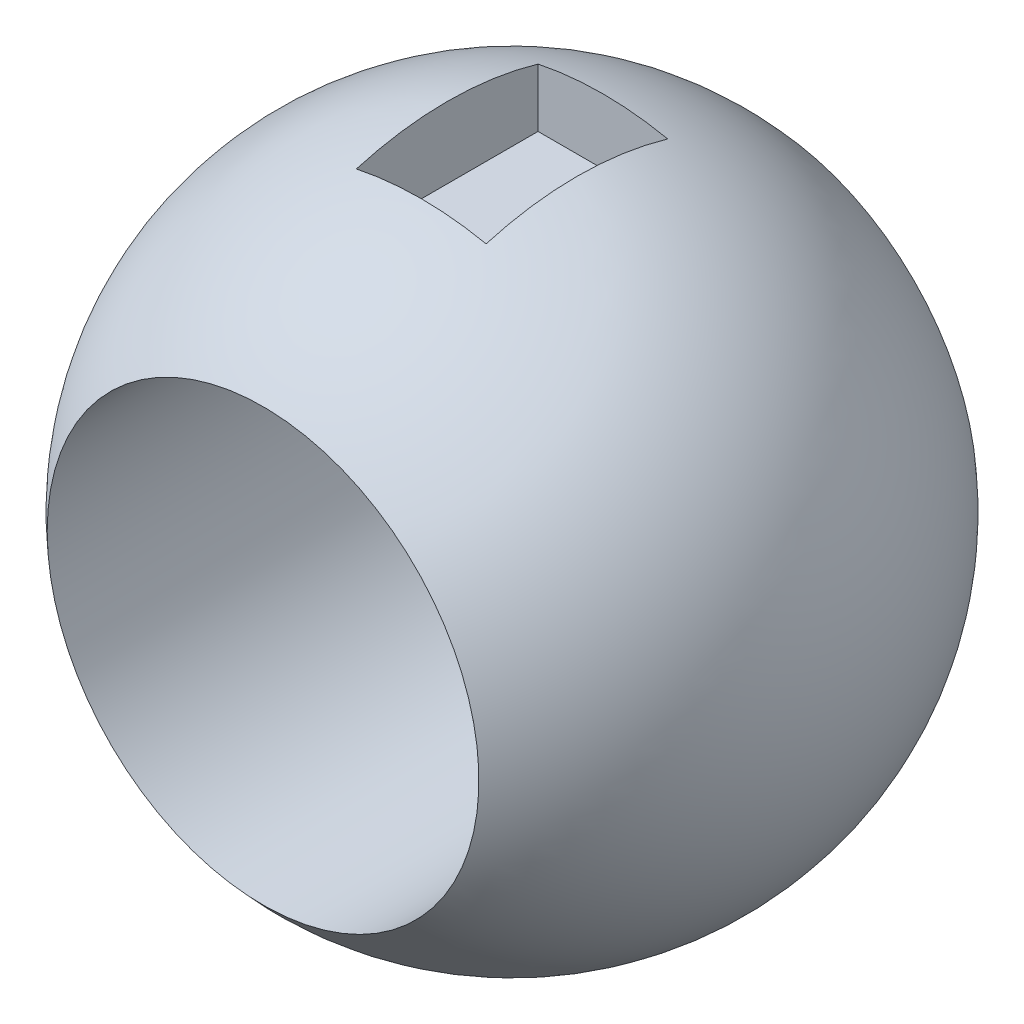
ISO-10303-21;
HEADER;
FILE_DESCRIPTION(('STEP AP214'),'2;1');
FILE_NAME('part.step','',(''),(''),'','','');
FILE_SCHEMA(('AUTOMOTIVE_DESIGN { 1 0 10303 214 1 1 1 1 }'));
ENDSEC;
DATA;
#1=APPLICATION_CONTEXT('core data for automotive mechanical design processes');
#2=APPLICATION_PROTOCOL_DEFINITION('international standard','automotive_design',2000,#1);
#3=PRODUCT_CONTEXT('',#1,'mechanical');
#4=PRODUCT('Part','Part','',(#3));
#5=PRODUCT_RELATED_PRODUCT_CATEGORY('part','',(#4));
#6=PRODUCT_DEFINITION_FORMATION('','',#4);
#7=PRODUCT_DEFINITION_CONTEXT('part definition',#1,'design');
#8=PRODUCT_DEFINITION('design','',#6,#7);
#9=PRODUCT_DEFINITION_SHAPE('','',#8);
#10=(LENGTH_UNIT() NAMED_UNIT(*) SI_UNIT(.MILLI.,.METRE.));
#11=(NAMED_UNIT(*) PLANE_ANGLE_UNIT() SI_UNIT($,.RADIAN.));
#12=(NAMED_UNIT(*) SI_UNIT($,.STERADIAN.) SOLID_ANGLE_UNIT());
#13=UNCERTAINTY_MEASURE_WITH_UNIT(LENGTH_MEASURE(1.E-05),#10,'distance_accuracy_value','');
#14=(GEOMETRIC_REPRESENTATION_CONTEXT(3) GLOBAL_UNCERTAINTY_ASSIGNED_CONTEXT((#13)) GLOBAL_UNIT_ASSIGNED_CONTEXT((#10,
#11,#12)) REPRESENTATION_CONTEXT('',''));
#15=CARTESIAN_POINT('',(0.,0.,0.));
#16=DIRECTION('',(0.,0.,1.));
#17=DIRECTION('',(1.,0.,0.));
#18=AXIS2_PLACEMENT_3D('',#15,#16,#17);
#19=CARTESIAN_POINT('',(0.,0.,0.));
#20=DIRECTION('',(0.,0.,-1.));
#21=DIRECTION('',(-1.,0.,0.));
#22=AXIS2_PLACEMENT_3D('',#19,#20,#21);
#23=SPHERICAL_SURFACE('',#22,25.4);
#24=CARTESIAN_POINT('',(-5.,0.,0.));
#25=DIRECTION('',(-1.,0.,0.));
#26=DIRECTION('',(0.,0.,1.));
#27=AXIS2_PLACEMENT_3D('',#24,#25,#26);
#28=CIRCLE('',#27,24.9030118660374);
#29=CARTESIAN_POINT('',(-5.,23.8989539520038,-7.));
#30=VERTEX_POINT('',#29);
#31=CARTESIAN_POINT('',(-5.,23.8989539520038,7.));
#32=VERTEX_POINT('',#31);
#33=EDGE_CURVE('E11',#30,#32,#28,.F.);
#34=ORIENTED_EDGE('',*,*,#33,.F.);
#35=CARTESIAN_POINT('',(0.,0.,-7.));
#36=DIRECTION('',(0.,0.,-1.));
#37=DIRECTION('',(-1.,0.,0.));
#38=AXIS2_PLACEMENT_3D('',#35,#36,#37);
#39=CIRCLE('',#38,24.416387939251);
#40=CARTESIAN_POINT('',(5.,23.8989539520038,-7.));
#41=VERTEX_POINT('',#40);
#42=EDGE_CURVE('E53',#41,#30,#39,.F.);
#43=ORIENTED_EDGE('',*,*,#42,.F.);
#44=CARTESIAN_POINT('',(5.,0.,0.));
#45=DIRECTION('',(1.,0.,0.));
#46=DIRECTION('',(0.,0.,-1.));
#47=AXIS2_PLACEMENT_3D('',#44,#45,#46);
#48=CIRCLE('',#47,24.9030118660374);
#49=CARTESIAN_POINT('',(5.,23.8989539520038,7.));
#50=VERTEX_POINT('',#49);
#51=EDGE_CURVE('E132',#50,#41,#48,.F.);
#52=ORIENTED_EDGE('',*,*,#51,.F.);
#53=CARTESIAN_POINT('',(0.,0.,7.));
#54=DIRECTION('',(0.,0.,1.));
#55=DIRECTION('',(1.,0.,0.));
#56=AXIS2_PLACEMENT_3D('',#53,#54,#55);
#57=CIRCLE('',#56,24.416387939251);
#58=EDGE_CURVE('E129',#32,#50,#57,.F.);
#59=ORIENTED_EDGE('',*,*,#58,.F.);
#60=EDGE_LOOP('',(#34,#43,#52,#59));
#61=FACE_BOUND('',#60,.T.);
#62=CARTESIAN_POINT('',(0.,0.,19.1929734798962));
#63=DIRECTION('',(0.,0.,-1.));
#64=DIRECTION('',(-1.,0.,0.));
#65=AXIS2_PLACEMENT_3D('',#62,#63,#64);
#66=CIRCLE('',#65,16.637);
#67=CARTESIAN_POINT('',(-16.637,0.,19.1929734798962));
#68=VERTEX_POINT('',#67);
#69=EDGE_CURVE('E125',#68,#68,#66,.F.);
#70=ORIENTED_EDGE('',*,*,#69,.F.);
#71=EDGE_LOOP('',(#70));
#72=FACE_BOUND('',#71,.T.);
#73=CARTESIAN_POINT('',(0.,0.,-19.1929734798962));
#74=DIRECTION('',(0.,0.,1.));
#75=DIRECTION('',(1.,0.,0.));
#76=AXIS2_PLACEMENT_3D('',#73,#74,#75);
#77=CIRCLE('',#76,16.637);
#78=CARTESIAN_POINT('',(16.637,0.,-19.1929734798962));
#79=VERTEX_POINT('',#78);
#80=EDGE_CURVE('E116',#79,#79,#77,.F.);
#81=ORIENTED_EDGE('',*,*,#80,.F.);
#82=EDGE_LOOP('',(#81));
#83=FACE_BOUND('',#82,.T.);
#84=ADVANCED_FACE('F45',(#61,#72,#83),#23,.T.);
#85=CARTESIAN_POINT('',(0.,0.,-22.3866031366976));
#86=DIRECTION('',(0.,0.,1.));
#87=DIRECTION('',(1.,0.,0.));
#88=AXIS2_PLACEMENT_3D('',#85,#86,#87);
#89=CYLINDRICAL_SURFACE('',#88,16.637);
#90=ORIENTED_EDGE('',*,*,#69,.T.);
#91=EDGE_LOOP('',(#90));
#92=FACE_BOUND('',#91,.T.);
#93=ORIENTED_EDGE('',*,*,#80,.T.);
#94=EDGE_LOOP('',(#93));
#95=FACE_BOUND('',#94,.T.);
#96=ADVANCED_FACE('F142',(#92,#95),#89,.F.);
#97=CARTESIAN_POINT('',(-5.,19.4,7.));
#98=DIRECTION('',(-1.,0.,0.));
#99=DIRECTION('',(0.,0.,1.));
#100=AXIS2_PLACEMENT_3D('',#97,#98,#99);
#101=PLANE('',#100);
#102=ORIENTED_EDGE('',*,*,#33,.T.);
#103=DIRECTION('',(0.,1.,0.));
#104=VECTOR('',#103,1.);
#105=CARTESIAN_POINT('',(-5.,19.4,7.));
#106=LINE('',#105,#104);
#107=CARTESIAN_POINT('',(-5.,19.4,7.));
#108=VERTEX_POINT('',#107);
#109=EDGE_CURVE('E60',#108,#32,#106,.T.);
#110=ORIENTED_EDGE('',*,*,#109,.F.);
#111=DIRECTION('',(0.,0.,1.));
#112=VECTOR('',#111,1.);
#113=CARTESIAN_POINT('',(-5.,19.4,7.));
#114=LINE('',#113,#112);
#115=CARTESIAN_POINT('',(-5.,19.4,-7.));
#116=VERTEX_POINT('',#115);
#117=EDGE_CURVE('E86',#116,#108,#114,.T.);
#118=ORIENTED_EDGE('',*,*,#117,.F.);
#119=DIRECTION('',(0.,1.,0.));
#120=VECTOR('',#119,1.);
#121=CARTESIAN_POINT('',(-5.,19.4,-7.));
#122=LINE('',#121,#120);
#123=EDGE_CURVE('E113',#116,#30,#122,.T.);
#124=ORIENTED_EDGE('',*,*,#123,.T.);
#125=EDGE_LOOP('',(#102,#110,#118,#124));
#126=FACE_BOUND('',#125,.T.);
#127=ADVANCED_FACE('F84',(#126),#101,.F.);
#128=CARTESIAN_POINT('',(5.,19.4,-7.));
#129=DIRECTION('',(0.,0.,-1.));
#130=DIRECTION('',(-1.,0.,0.));
#131=AXIS2_PLACEMENT_3D('',#128,#129,#130);
#132=PLANE('',#131);
#133=ORIENTED_EDGE('',*,*,#42,.T.);
#134=ORIENTED_EDGE('',*,*,#123,.F.);
#135=DIRECTION('',(-1.,0.,0.));
#136=VECTOR('',#135,1.);
#137=CARTESIAN_POINT('',(5.,19.4,-7.));
#138=LINE('',#137,#136);
#139=CARTESIAN_POINT('',(5.,19.4,-7.));
#140=VERTEX_POINT('',#139);
#141=EDGE_CURVE('E92',#140,#116,#138,.T.);
#142=ORIENTED_EDGE('',*,*,#141,.F.);
#143=DIRECTION('',(0.,1.,0.));
#144=VECTOR('',#143,1.);
#145=CARTESIAN_POINT('',(5.,19.4,-7.));
#146=LINE('',#145,#144);
#147=EDGE_CURVE('E117',#140,#41,#146,.T.);
#148=ORIENTED_EDGE('',*,*,#147,.T.);
#149=EDGE_LOOP('',(#133,#134,#142,#148));
#150=FACE_BOUND('',#149,.T.);
#151=ADVANCED_FACE('F139',(#150),#132,.F.);
#152=CARTESIAN_POINT('',(5.,19.4,7.));
#153=DIRECTION('',(1.,0.,0.));
#154=DIRECTION('',(0.,0.,-1.));
#155=AXIS2_PLACEMENT_3D('',#152,#153,#154);
#156=PLANE('',#155);
#157=ORIENTED_EDGE('',*,*,#51,.T.);
#158=ORIENTED_EDGE('',*,*,#147,.F.);
#159=DIRECTION('',(0.,0.,-1.));
#160=VECTOR('',#159,1.);
#161=CARTESIAN_POINT('',(5.,19.4,7.));
#162=LINE('',#161,#160);
#163=CARTESIAN_POINT('',(5.,19.4,7.));
#164=VERTEX_POINT('',#163);
#165=EDGE_CURVE('E102',#164,#140,#162,.T.);
#166=ORIENTED_EDGE('',*,*,#165,.F.);
#167=DIRECTION('',(0.,1.,0.));
#168=VECTOR('',#167,1.);
#169=CARTESIAN_POINT('',(5.,19.4,7.));
#170=LINE('',#169,#168);
#171=EDGE_CURVE('E91',#164,#50,#170,.T.);
#172=ORIENTED_EDGE('',*,*,#171,.T.);
#173=EDGE_LOOP('',(#157,#158,#166,#172));
#174=FACE_BOUND('',#173,.T.);
#175=ADVANCED_FACE('F137',(#174),#156,.F.);
#176=CARTESIAN_POINT('',(5.,19.4,7.));
#177=DIRECTION('',(0.,0.,1.));
#178=DIRECTION('',(1.,0.,0.));
#179=AXIS2_PLACEMENT_3D('',#176,#177,#178);
#180=PLANE('',#179);
#181=ORIENTED_EDGE('',*,*,#58,.T.);
#182=ORIENTED_EDGE('',*,*,#171,.F.);
#183=DIRECTION('',(1.,0.,0.));
#184=VECTOR('',#183,1.);
#185=CARTESIAN_POINT('',(5.,19.4,7.));
#186=LINE('',#185,#184);
#187=EDGE_CURVE('E95',#108,#164,#186,.T.);
#188=ORIENTED_EDGE('',*,*,#187,.F.);
#189=ORIENTED_EDGE('',*,*,#109,.T.);
#190=EDGE_LOOP('',(#181,#182,#188,#189));
#191=FACE_BOUND('',#190,.T.);
#192=ADVANCED_FACE('F96',(#191),#180,.F.);
#193=CARTESIAN_POINT('',(0.,19.4,0.));
#194=DIRECTION('',(0.,1.,0.));
#195=DIRECTION('',(0.,0.,1.));
#196=AXIS2_PLACEMENT_3D('',#193,#194,#195);
#197=PLANE('',#196);
#198=ORIENTED_EDGE('',*,*,#117,.T.);
#199=ORIENTED_EDGE('',*,*,#187,.T.);
#200=ORIENTED_EDGE('',*,*,#165,.T.);
#201=ORIENTED_EDGE('',*,*,#141,.T.);
#202=EDGE_LOOP('',(#198,#199,#200,#201));
#203=FACE_BOUND('',#202,.T.);
#204=ADVANCED_FACE('F104',(#203),#197,.T.);
#205=CLOSED_SHELL('',(#84,#96,#127,#151,#175,#192,#204));
#206=MANIFOLD_SOLID_BREP('B2',#205);
#207=ADVANCED_BREP_SHAPE_REPRESENTATION('',(#18,#206),#14);
#208=SHAPE_DEFINITION_REPRESENTATION(#9,#207);
ENDSEC;
END-ISO-10303-21;
